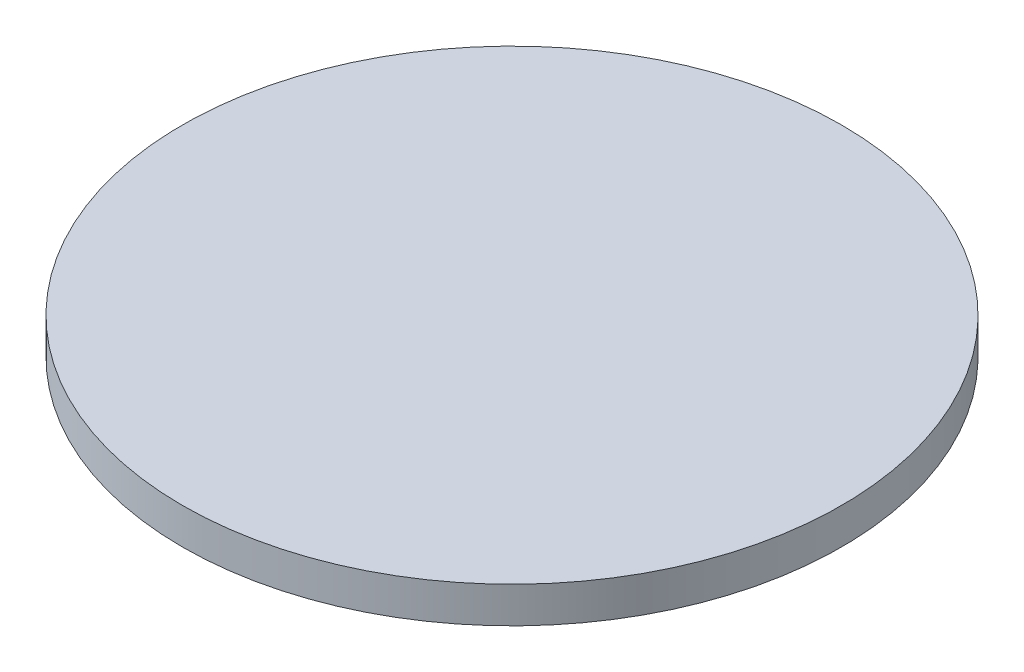
ISO-10303-21;
HEADER;
FILE_DESCRIPTION(('STEP AP214'),'2;1');
FILE_NAME('part.step','',(''),(''),'','','');
FILE_SCHEMA(('AUTOMOTIVE_DESIGN { 1 0 10303 214 1 1 1 1 }'));
ENDSEC;
DATA;
#1=APPLICATION_CONTEXT('core data for automotive mechanical design processes');
#2=APPLICATION_PROTOCOL_DEFINITION('international standard','automotive_design',2000,#1);
#3=PRODUCT_CONTEXT('',#1,'mechanical');
#4=PRODUCT('Part','Part','',(#3));
#5=PRODUCT_RELATED_PRODUCT_CATEGORY('part','',(#4));
#6=PRODUCT_DEFINITION_FORMATION('','',#4);
#7=PRODUCT_DEFINITION_CONTEXT('part definition',#1,'design');
#8=PRODUCT_DEFINITION('design','',#6,#7);
#9=PRODUCT_DEFINITION_SHAPE('','',#8);
#10=(LENGTH_UNIT() NAMED_UNIT(*) SI_UNIT(.MILLI.,.METRE.));
#11=(NAMED_UNIT(*) PLANE_ANGLE_UNIT() SI_UNIT($,.RADIAN.));
#12=(NAMED_UNIT(*) SI_UNIT($,.STERADIAN.) SOLID_ANGLE_UNIT());
#13=UNCERTAINTY_MEASURE_WITH_UNIT(LENGTH_MEASURE(1.E-05),#10,'distance_accuracy_value','');
#14=(GEOMETRIC_REPRESENTATION_CONTEXT(3) GLOBAL_UNCERTAINTY_ASSIGNED_CONTEXT((#13)) GLOBAL_UNIT_ASSIGNED_CONTEXT((#10,
#11,#12)) REPRESENTATION_CONTEXT('',''));
#15=CARTESIAN_POINT('',(0.,0.,0.));
#16=DIRECTION('',(0.,0.,1.));
#17=DIRECTION('',(1.,0.,0.));
#18=AXIS2_PLACEMENT_3D('',#15,#16,#17);
#19=CARTESIAN_POINT('',(0.,7.,0.));
#20=DIRECTION('',(0.,-1.,0.));
#21=DIRECTION('',(0.,0.,-1.));
#22=AXIS2_PLACEMENT_3D('',#19,#20,#21);
#23=CYLINDRICAL_SURFACE('',#22,64.);
#24=CARTESIAN_POINT('',(0.,7.,0.));
#25=DIRECTION('',(0.,1.,0.));
#26=DIRECTION('',(0.,0.,1.));
#27=AXIS2_PLACEMENT_3D('',#24,#25,#26);
#28=CIRCLE('',#27,64.);
#29=CARTESIAN_POINT('',(0.,7.,64.));
#30=VERTEX_POINT('',#29);
#31=EDGE_CURVE('E10',#30,#30,#28,.T.);
#32=ORIENTED_EDGE('',*,*,#31,.F.);
#33=EDGE_LOOP('',(#32));
#34=FACE_BOUND('',#33,.T.);
#35=CARTESIAN_POINT('',(0.,0.,0.));
#36=DIRECTION('',(0.,1.,0.));
#37=DIRECTION('',(0.,0.,1.));
#38=AXIS2_PLACEMENT_3D('',#35,#36,#37);
#39=CIRCLE('',#38,64.);
#40=CARTESIAN_POINT('',(0.,0.,64.));
#41=VERTEX_POINT('',#40);
#42=EDGE_CURVE('E35',#41,#41,#39,.T.);
#43=ORIENTED_EDGE('',*,*,#42,.T.);
#44=EDGE_LOOP('',(#43));
#45=FACE_BOUND('',#44,.T.);
#46=ADVANCED_FACE('F32',(#34,#45),#23,.T.);
#47=CARTESIAN_POINT('',(0.,7.,0.));
#48=DIRECTION('',(0.,1.,0.));
#49=DIRECTION('',(0.,0.,1.));
#50=AXIS2_PLACEMENT_3D('',#47,#48,#49);
#51=PLANE('',#50);
#52=ORIENTED_EDGE('',*,*,#31,.T.);
#53=EDGE_LOOP('',(#52));
#54=FACE_BOUND('',#53,.T.);
#55=ADVANCED_FACE('F47',(#54),#51,.T.);
#56=CARTESIAN_POINT('',(0.,0.,0.));
#57=DIRECTION('',(0.,1.,0.));
#58=DIRECTION('',(0.,0.,1.));
#59=AXIS2_PLACEMENT_3D('',#56,#57,#58);
#60=PLANE('',#59);
#61=ORIENTED_EDGE('',*,*,#42,.F.);
#62=EDGE_LOOP('',(#61));
#63=FACE_BOUND('',#62,.T.);
#64=ADVANCED_FACE('F45',(#63),#60,.F.);
#65=CLOSED_SHELL('',(#46,#55,#64));
#66=MANIFOLD_SOLID_BREP('B2',#65);
#67=ADVANCED_BREP_SHAPE_REPRESENTATION('',(#18,#66),#14);
#68=SHAPE_DEFINITION_REPRESENTATION(#9,#67);
ENDSEC;
END-ISO-10303-21;
